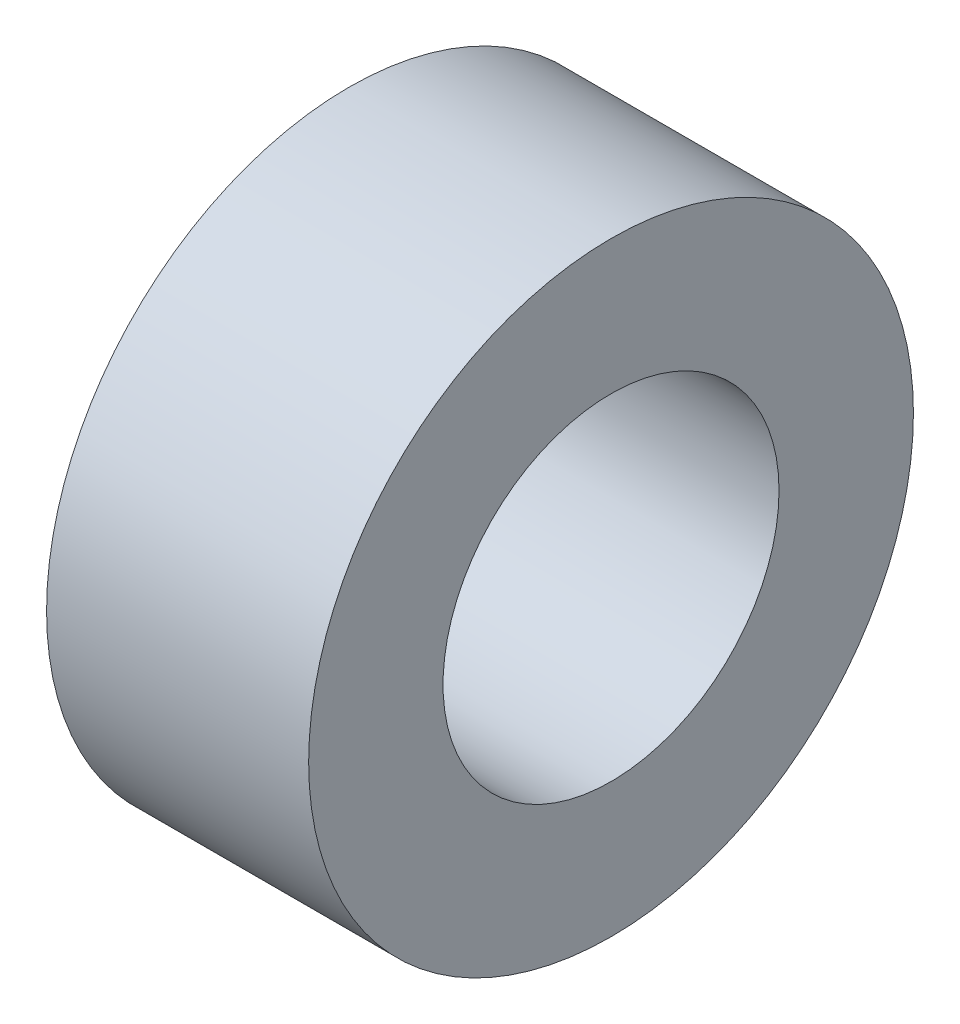
ISO-10303-21;
HEADER;
FILE_DESCRIPTION(('STEP AP214'),'2;1');
FILE_NAME('part.step','',(''),(''),'','','');
FILE_SCHEMA(('AUTOMOTIVE_DESIGN { 1 0 10303 214 1 1 1 1 }'));
ENDSEC;
DATA;
#1=APPLICATION_CONTEXT('core data for automotive mechanical design processes');
#2=APPLICATION_PROTOCOL_DEFINITION('international standard','automotive_design',2000,#1);
#3=PRODUCT_CONTEXT('',#1,'mechanical');
#4=PRODUCT('Part','Part','',(#3));
#5=PRODUCT_RELATED_PRODUCT_CATEGORY('part','',(#4));
#6=PRODUCT_DEFINITION_FORMATION('','',#4);
#7=PRODUCT_DEFINITION_CONTEXT('part definition',#1,'design');
#8=PRODUCT_DEFINITION('design','',#6,#7);
#9=PRODUCT_DEFINITION_SHAPE('','',#8);
#10=(LENGTH_UNIT() NAMED_UNIT(*) SI_UNIT(.MILLI.,.METRE.));
#11=(NAMED_UNIT(*) PLANE_ANGLE_UNIT() SI_UNIT($,.RADIAN.));
#12=(NAMED_UNIT(*) SI_UNIT($,.STERADIAN.) SOLID_ANGLE_UNIT());
#13=UNCERTAINTY_MEASURE_WITH_UNIT(LENGTH_MEASURE(1.E-05),#10,'distance_accuracy_value','');
#14=(GEOMETRIC_REPRESENTATION_CONTEXT(3) GLOBAL_UNCERTAINTY_ASSIGNED_CONTEXT((#13)) GLOBAL_UNIT_ASSIGNED_CONTEXT((#10,
#11,#12)) REPRESENTATION_CONTEXT('',''));
#15=CARTESIAN_POINT('',(0.,0.,0.));
#16=DIRECTION('',(0.,0.,1.));
#17=DIRECTION('',(1.,0.,0.));
#18=AXIS2_PLACEMENT_3D('',#15,#16,#17);
#19=CARTESIAN_POINT('',(-19.5,45.,0.));
#20=DIRECTION('',(-1.,0.,0.));
#21=DIRECTION('',(0.,0.,1.));
#22=AXIS2_PLACEMENT_3D('',#19,#20,#21);
#23=PLANE('',#22);
#24=CARTESIAN_POINT('',(-19.5,0.,0.));
#25=DIRECTION('',(1.,0.,0.));
#26=DIRECTION('',(0.,0.,-1.));
#27=AXIS2_PLACEMENT_3D('',#24,#25,#26);
#28=CIRCLE('',#27,25.);
#29=CARTESIAN_POINT('',(-19.5,0.,-25.));
#30=VERTEX_POINT('',#29);
#31=EDGE_CURVE('E10',#30,#30,#28,.T.);
#32=ORIENTED_EDGE('',*,*,#31,.T.);
#33=EDGE_LOOP('',(#32));
#34=FACE_BOUND('',#33,.T.);
#35=CARTESIAN_POINT('',(-19.5,0.,0.));
#36=DIRECTION('',(1.,0.,0.));
#37=DIRECTION('',(0.,0.,-1.));
#38=AXIS2_PLACEMENT_3D('',#35,#36,#37);
#39=CIRCLE('',#38,45.);
#40=CARTESIAN_POINT('',(-19.5,0.,-45.));
#41=VERTEX_POINT('',#40);
#42=EDGE_CURVE('E45',#41,#41,#39,.T.);
#43=ORIENTED_EDGE('',*,*,#42,.F.);
#44=EDGE_LOOP('',(#43));
#45=FACE_BOUND('',#44,.T.);
#46=ADVANCED_FACE('F31',(#34,#45),#23,.T.);
#47=CARTESIAN_POINT('',(54.9038461538462,0.,0.));
#48=DIRECTION('',(1.,0.,0.));
#49=DIRECTION('',(0.,0.,-1.));
#50=AXIS2_PLACEMENT_3D('',#47,#48,#49);
#51=CYLINDRICAL_SURFACE('',#50,25.);
#52=CARTESIAN_POINT('',(19.5,0.,0.));
#53=DIRECTION('',(1.,0.,0.));
#54=DIRECTION('',(0.,0.,-1.));
#55=AXIS2_PLACEMENT_3D('',#52,#53,#54);
#56=CIRCLE('',#55,25.);
#57=CARTESIAN_POINT('',(19.5,0.,-25.));
#58=VERTEX_POINT('',#57);
#59=EDGE_CURVE('E37',#58,#58,#56,.T.);
#60=ORIENTED_EDGE('',*,*,#59,.T.);
#61=EDGE_LOOP('',(#60));
#62=FACE_BOUND('',#61,.T.);
#63=ORIENTED_EDGE('',*,*,#31,.F.);
#64=EDGE_LOOP('',(#63));
#65=FACE_BOUND('',#64,.T.);
#66=ADVANCED_FACE('F55',(#62,#65),#51,.F.);
#67=CARTESIAN_POINT('',(19.5,45.,0.));
#68=DIRECTION('',(1.,0.,0.));
#69=DIRECTION('',(0.,0.,-1.));
#70=AXIS2_PLACEMENT_3D('',#67,#68,#69);
#71=PLANE('',#70);
#72=CARTESIAN_POINT('',(19.5,0.,0.));
#73=DIRECTION('',(1.,0.,0.));
#74=DIRECTION('',(0.,0.,-1.));
#75=AXIS2_PLACEMENT_3D('',#72,#73,#74);
#76=CIRCLE('',#75,45.);
#77=CARTESIAN_POINT('',(19.5,0.,-45.));
#78=VERTEX_POINT('',#77);
#79=EDGE_CURVE('E41',#78,#78,#76,.T.);
#80=ORIENTED_EDGE('',*,*,#79,.T.);
#81=EDGE_LOOP('',(#80));
#82=FACE_BOUND('',#81,.T.);
#83=ORIENTED_EDGE('',*,*,#59,.F.);
#84=EDGE_LOOP('',(#83));
#85=FACE_BOUND('',#84,.T.);
#86=ADVANCED_FACE('F59',(#82,#85),#71,.T.);
#87=CARTESIAN_POINT('',(54.9038461538462,0.,0.));
#88=DIRECTION('',(1.,0.,0.));
#89=DIRECTION('',(0.,0.,-1.));
#90=AXIS2_PLACEMENT_3D('',#87,#88,#89);
#91=CYLINDRICAL_SURFACE('',#90,45.);
#92=ORIENTED_EDGE('',*,*,#42,.T.);
#93=EDGE_LOOP('',(#92));
#94=FACE_BOUND('',#93,.T.);
#95=ORIENTED_EDGE('',*,*,#79,.F.);
#96=EDGE_LOOP('',(#95));
#97=FACE_BOUND('',#96,.T.);
#98=ADVANCED_FACE('F51',(#94,#97),#91,.T.);
#99=CLOSED_SHELL('',(#46,#66,#86,#98));
#100=MANIFOLD_SOLID_BREP('B2',#99);
#101=ADVANCED_BREP_SHAPE_REPRESENTATION('',(#18,#100),#14);
#102=SHAPE_DEFINITION_REPRESENTATION(#9,#101);
ENDSEC;
END-ISO-10303-21;
